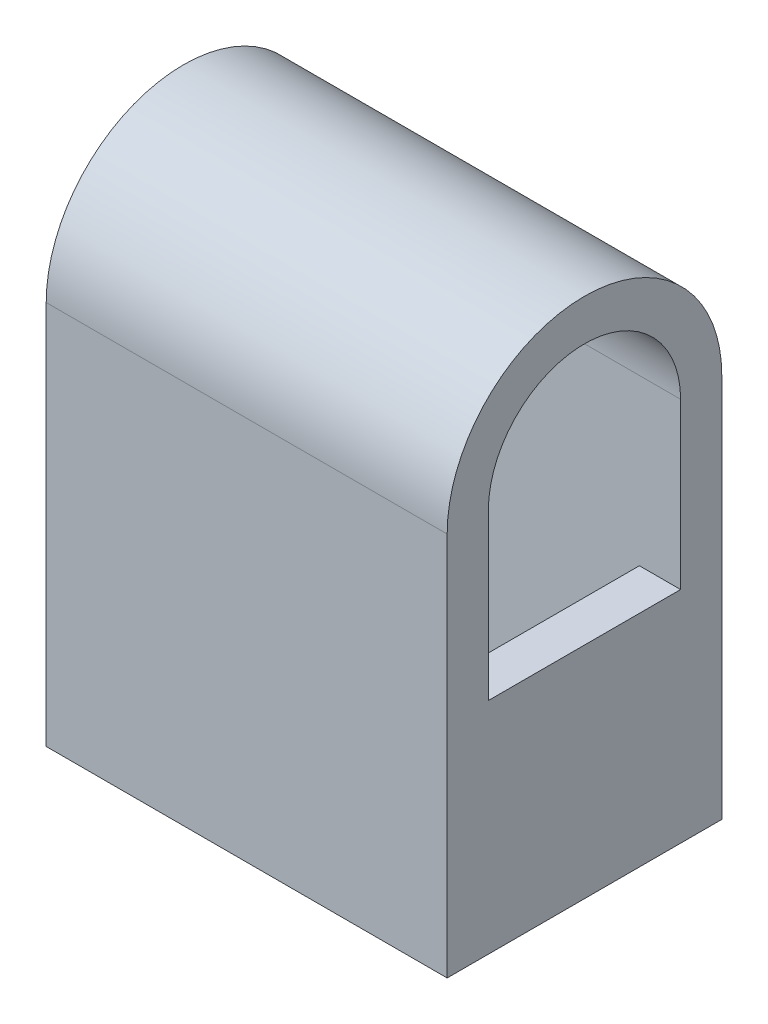
ISO-10303-21;
HEADER;
FILE_DESCRIPTION(('STEP AP214'),'2;1');
FILE_NAME('part.step','',(''),(''),'','','');
FILE_SCHEMA(('AUTOMOTIVE_DESIGN { 1 0 10303 214 1 1 1 1 }'));
ENDSEC;
DATA;
#1=APPLICATION_CONTEXT('core data for automotive mechanical design processes');
#2=APPLICATION_PROTOCOL_DEFINITION('international standard','automotive_design',2000,#1);
#3=PRODUCT_CONTEXT('',#1,'mechanical');
#4=PRODUCT('Part','Part','',(#3));
#5=PRODUCT_RELATED_PRODUCT_CATEGORY('part','',(#4));
#6=PRODUCT_DEFINITION_FORMATION('','',#4);
#7=PRODUCT_DEFINITION_CONTEXT('part definition',#1,'design');
#8=PRODUCT_DEFINITION('design','',#6,#7);
#9=PRODUCT_DEFINITION_SHAPE('','',#8);
#10=(LENGTH_UNIT() NAMED_UNIT(*) SI_UNIT(.MILLI.,.METRE.));
#11=(NAMED_UNIT(*) PLANE_ANGLE_UNIT() SI_UNIT($,.RADIAN.));
#12=(NAMED_UNIT(*) SI_UNIT($,.STERADIAN.) SOLID_ANGLE_UNIT());
#13=UNCERTAINTY_MEASURE_WITH_UNIT(LENGTH_MEASURE(1.E-05),#10,'distance_accuracy_value','');
#14=(GEOMETRIC_REPRESENTATION_CONTEXT(3) GLOBAL_UNCERTAINTY_ASSIGNED_CONTEXT((#13)) GLOBAL_UNIT_ASSIGNED_CONTEXT((#10,
#11,#12)) REPRESENTATION_CONTEXT('',''));
#15=CARTESIAN_POINT('',(0.,0.,0.));
#16=DIRECTION('',(0.,0.,1.));
#17=DIRECTION('',(1.,0.,0.));
#18=AXIS2_PLACEMENT_3D('',#15,#16,#17);
#19=CARTESIAN_POINT('',(0.,0.,-12.7));
#20=DIRECTION('',(0.,0.,1.));
#21=DIRECTION('',(1.,0.,0.));
#22=AXIS2_PLACEMENT_3D('',#19,#20,#21);
#23=PLANE('',#22);
#24=DIRECTION('',(0.,-1.,0.));
#25=VECTOR('',#24,1.);
#26=CARTESIAN_POINT('',(6.35,-8.89,-12.7));
#27=LINE('',#26,#25);
#28=CARTESIAN_POINT('',(6.35,3.81,-12.7));
#29=VERTEX_POINT('',#28);
#30=CARTESIAN_POINT('',(6.35,-8.89,-12.7));
#31=VERTEX_POINT('',#30);
#32=EDGE_CURVE('E199',#29,#31,#27,.T.);
#33=ORIENTED_EDGE('',*,*,#32,.F.);
#34=DIRECTION('',(1.,0.,0.));
#35=VECTOR('',#34,1.);
#36=CARTESIAN_POINT('',(6.35,3.81,-12.7));
#37=LINE('',#36,#35);
#38=CARTESIAN_POINT('',(5.08,3.81,-12.7));
#39=VERTEX_POINT('',#38);
#40=EDGE_CURVE('E219',#39,#29,#37,.T.);
#41=ORIENTED_EDGE('',*,*,#40,.F.);
#42=DIRECTION('',(0.,1.,0.));
#43=VECTOR('',#42,1.);
#44=CARTESIAN_POINT('',(5.08,-8.89,-12.7));
#45=LINE('',#44,#43);
#46=CARTESIAN_POINT('',(5.08,-8.89,-12.7));
#47=VERTEX_POINT('',#46);
#48=EDGE_CURVE('E197',#47,#39,#45,.T.);
#49=ORIENTED_EDGE('',*,*,#48,.F.);
#50=DIRECTION('',(1.,0.,0.));
#51=VECTOR('',#50,1.);
#52=CARTESIAN_POINT('',(-5.08,-8.89,-12.7));
#53=LINE('',#52,#51);
#54=CARTESIAN_POINT('',(-5.08,-8.89,-12.7));
#55=VERTEX_POINT('',#54);
#56=EDGE_CURVE('E177',#55,#47,#53,.T.);
#57=ORIENTED_EDGE('',*,*,#56,.F.);
#58=DIRECTION('',(0.,1.,0.));
#59=VECTOR('',#58,1.);
#60=CARTESIAN_POINT('',(-5.08,-8.89,-12.7));
#61=LINE('',#60,#59);
#62=CARTESIAN_POINT('',(-5.08,3.81,-12.7));
#63=VERTEX_POINT('',#62);
#64=EDGE_CURVE('E200',#55,#63,#61,.T.);
#65=ORIENTED_EDGE('',*,*,#64,.T.);
#66=CARTESIAN_POINT('',(-6.35,3.81,-12.7));
#67=VERTEX_POINT('',#66);
#68=EDGE_CURVE('E207',#67,#63,#37,.T.);
#69=ORIENTED_EDGE('',*,*,#68,.F.);
#70=DIRECTION('',(0.,1.,0.));
#71=VECTOR('',#70,1.);
#72=CARTESIAN_POINT('',(-6.35,3.81,-12.7));
#73=LINE('',#72,#71);
#74=CARTESIAN_POINT('',(-6.35,-8.89,-12.7));
#75=VERTEX_POINT('',#74);
#76=EDGE_CURVE('E216',#75,#67,#73,.T.);
#77=ORIENTED_EDGE('',*,*,#76,.F.);
#78=DIRECTION('',(1.,0.,0.));
#79=VECTOR('',#78,1.);
#80=CARTESIAN_POINT('',(9.271,-8.89,-12.7));
#81=LINE('',#80,#79);
#82=CARTESIAN_POINT('',(-9.271,-8.89,-12.7));
#83=VERTEX_POINT('',#82);
#84=EDGE_CURVE('E284',#83,#75,#81,.T.);
#85=ORIENTED_EDGE('',*,*,#84,.F.);
#86=DIRECTION('',(0.,-1.,0.));
#87=VECTOR('',#86,1.);
#88=CARTESIAN_POINT('',(-9.271,-8.89,-12.7));
#89=LINE('',#88,#87);
#90=CARTESIAN_POINT('',(-9.271,8.89,-12.7));
#91=VERTEX_POINT('',#90);
#92=EDGE_CURVE('E270',#91,#83,#89,.T.);
#93=ORIENTED_EDGE('',*,*,#92,.F.);
#94=DIRECTION('',(-1.,0.,0.));
#95=VECTOR('',#94,1.);
#96=CARTESIAN_POINT('',(23.4700316571237,8.89,-12.7));
#97=LINE('',#96,#95);
#98=CARTESIAN_POINT('',(9.271,8.89,-12.7));
#99=VERTEX_POINT('',#98);
#100=EDGE_CURVE('E301',#99,#91,#97,.T.);
#101=ORIENTED_EDGE('',*,*,#100,.F.);
#102=DIRECTION('',(0.,1.,0.));
#103=VECTOR('',#102,1.);
#104=CARTESIAN_POINT('',(9.271,-8.89,-12.7));
#105=LINE('',#104,#103);
#106=CARTESIAN_POINT('',(9.271,-8.89,-12.7));
#107=VERTEX_POINT('',#106);
#108=EDGE_CURVE('E276',#107,#99,#105,.T.);
#109=ORIENTED_EDGE('',*,*,#108,.F.);
#110=EDGE_CURVE('E283',#31,#107,#81,.T.);
#111=ORIENTED_EDGE('',*,*,#110,.F.);
#112=EDGE_LOOP('',(#33,#41,#49,#57,#65,#69,#77,#85,#93,#101,#109,#111));
#113=FACE_BOUND('',#112,.T.);
#114=ADVANCED_FACE('F33',(#113),#23,.F.);
#115=CARTESIAN_POINT('',(9.271,-8.89,-1.905));
#116=DIRECTION('',(1.,0.,0.));
#117=DIRECTION('',(0.,0.,-1.));
#118=AXIS2_PLACEMENT_3D('',#115,#116,#117);
#119=PLANE('',#118);
#120=DIRECTION('',(0.,0.,1.));
#121=VECTOR('',#120,1.);
#122=CARTESIAN_POINT('',(9.271,1.27,-1.905));
#123=LINE('',#122,#121);
#124=CARTESIAN_POINT('',(9.271,1.27,-10.795));
#125=VERTEX_POINT('',#124);
#126=CARTESIAN_POINT('',(9.271,1.27,-1.905));
#127=VERTEX_POINT('',#126);
#128=EDGE_CURVE('E233',#125,#127,#123,.T.);
#129=ORIENTED_EDGE('',*,*,#128,.T.);
#130=DIRECTION('',(0.,1.,0.));
#131=VECTOR('',#130,1.);
#132=CARTESIAN_POINT('',(9.271,-8.89,-1.905));
#133=LINE('',#132,#131);
#134=CARTESIAN_POINT('',(9.271,8.89,-1.905));
#135=VERTEX_POINT('',#134);
#136=EDGE_CURVE('E305',#127,#135,#133,.T.);
#137=ORIENTED_EDGE('',*,*,#136,.T.);
#138=CARTESIAN_POINT('',(9.271,8.89,-6.35));
#139=DIRECTION('',(1.,0.,0.));
#140=DIRECTION('',(0.,0.,-1.));
#141=AXIS2_PLACEMENT_3D('',#138,#139,#140);
#142=CIRCLE('',#141,4.445);
#143=CARTESIAN_POINT('',(9.271,8.89,-10.795));
#144=VERTEX_POINT('',#143);
#145=EDGE_CURVE('E295',#144,#135,#142,.T.);
#146=ORIENTED_EDGE('',*,*,#145,.F.);
#147=DIRECTION('',(0.,1.,0.));
#148=VECTOR('',#147,1.);
#149=CARTESIAN_POINT('',(9.271,-8.89,-10.795));
#150=LINE('',#149,#148);
#151=EDGE_CURVE('E278',#125,#144,#150,.T.);
#152=ORIENTED_EDGE('',*,*,#151,.F.);
#153=EDGE_LOOP('',(#129,#137,#146,#152));
#154=FACE_BOUND('',#153,.T.);
#155=DIRECTION('',(0.,1.,0.));
#156=VECTOR('',#155,1.);
#157=CARTESIAN_POINT('',(9.271,-8.89,0.));
#158=LINE('',#157,#156);
#159=CARTESIAN_POINT('',(9.271,-8.89,0.));
#160=VERTEX_POINT('',#159);
#161=CARTESIAN_POINT('',(9.271,8.89,0.));
#162=VERTEX_POINT('',#161);
#163=EDGE_CURVE('E298',#160,#162,#158,.T.);
#164=ORIENTED_EDGE('',*,*,#163,.F.);
#165=DIRECTION('',(0.,0.,1.));
#166=VECTOR('',#165,1.);
#167=CARTESIAN_POINT('',(9.271,-8.89,-1.905));
#168=LINE('',#167,#166);
#169=EDGE_CURVE('E11',#107,#160,#168,.T.);
#170=ORIENTED_EDGE('',*,*,#169,.F.);
#171=ORIENTED_EDGE('',*,*,#108,.T.);
#172=CARTESIAN_POINT('',(9.271,8.89,-6.35));
#173=DIRECTION('',(1.,0.,0.));
#174=DIRECTION('',(0.,0.,-1.));
#175=AXIS2_PLACEMENT_3D('',#172,#173,#174);
#176=CIRCLE('',#175,6.35);
#177=EDGE_CURVE('E292',#162,#99,#176,.F.);
#178=ORIENTED_EDGE('',*,*,#177,.F.);
#179=EDGE_LOOP('',(#164,#170,#171,#178));
#180=FACE_BOUND('',#179,.T.);
#181=ADVANCED_FACE('F35',(#154,#180),#119,.T.);
#182=CARTESIAN_POINT('',(-9.271,-8.89,-1.905));
#183=DIRECTION('',(0.,-1.,0.));
#184=DIRECTION('',(0.,0.,-1.));
#185=AXIS2_PLACEMENT_3D('',#182,#183,#184);
#186=PLANE('',#185);
#187=DIRECTION('',(0.,0.,-1.));
#188=VECTOR('',#187,1.);
#189=CARTESIAN_POINT('',(5.08,-8.89,-12.7));
#190=LINE('',#189,#188);
#191=CARTESIAN_POINT('',(5.08,-8.89,-14.478));
#192=VERTEX_POINT('',#191);
#193=EDGE_CURVE('E171',#47,#192,#190,.T.);
#194=ORIENTED_EDGE('',*,*,#193,.T.);
#195=DIRECTION('',(-0.999984123697854,0.,0.00563492255810706));
#196=VECTOR('',#195,1.);
#197=CARTESIAN_POINT('',(5.08,-8.89,-14.478));
#198=LINE('',#197,#196);
#199=CARTESIAN_POINT('',(-5.08,-8.89,-14.420748277864));
#200=VERTEX_POINT('',#199);
#201=EDGE_CURVE('E180',#192,#200,#198,.T.);
#202=ORIENTED_EDGE('',*,*,#201,.T.);
#203=DIRECTION('',(0.,0.,1.));
#204=VECTOR('',#203,1.);
#205=CARTESIAN_POINT('',(-5.08,-8.89,-14.420748277864));
#206=LINE('',#205,#204);
#207=EDGE_CURVE('E48',#200,#55,#206,.T.);
#208=ORIENTED_EDGE('',*,*,#207,.T.);
#209=ORIENTED_EDGE('',*,*,#56,.T.);
#210=EDGE_LOOP('',(#194,#202,#208,#209));
#211=FACE_BOUND('',#210,.T.);
#212=ORIENTED_EDGE('',*,*,#84,.T.);
#213=DIRECTION('',(0.,0.,1.));
#214=VECTOR('',#213,1.);
#215=CARTESIAN_POINT('',(-6.35,-8.89,-14.986));
#216=LINE('',#215,#214);
#217=CARTESIAN_POINT('',(-6.35,-8.89,-14.986));
#218=VERTEX_POINT('',#217);
#219=EDGE_CURVE('E227',#218,#75,#216,.T.);
#220=ORIENTED_EDGE('',*,*,#219,.F.);
#221=DIRECTION('',(-1.,0.,0.));
#222=VECTOR('',#221,1.);
#223=CARTESIAN_POINT('',(-6.35,-8.89,-14.986));
#224=LINE('',#223,#222);
#225=CARTESIAN_POINT('',(6.35,-8.89,-14.986));
#226=VERTEX_POINT('',#225);
#227=EDGE_CURVE('E206',#226,#218,#224,.T.);
#228=ORIENTED_EDGE('',*,*,#227,.F.);
#229=DIRECTION('',(0.,0.,1.));
#230=VECTOR('',#229,1.);
#231=CARTESIAN_POINT('',(6.35,-8.89,-14.986));
#232=LINE('',#231,#230);
#233=EDGE_CURVE('E230',#226,#31,#232,.T.);
#234=ORIENTED_EDGE('',*,*,#233,.T.);
#235=ORIENTED_EDGE('',*,*,#110,.T.);
#236=ORIENTED_EDGE('',*,*,#169,.T.);
#237=DIRECTION('',(1.,0.,0.));
#238=VECTOR('',#237,1.);
#239=CARTESIAN_POINT('',(-9.271,-8.89,0.));
#240=LINE('',#239,#238);
#241=CARTESIAN_POINT('',(-9.271,-8.89,0.));
#242=VERTEX_POINT('',#241);
#243=EDGE_CURVE('E308',#242,#160,#240,.T.);
#244=ORIENTED_EDGE('',*,*,#243,.F.);
#245=DIRECTION('',(0.,0.,1.));
#246=VECTOR('',#245,1.);
#247=CARTESIAN_POINT('',(-9.271,-8.89,-1.905));
#248=LINE('',#247,#246);
#249=EDGE_CURVE('E37',#83,#242,#248,.T.);
#250=ORIENTED_EDGE('',*,*,#249,.F.);
#251=EDGE_LOOP('',(#212,#220,#228,#234,#235,#236,#244,#250));
#252=FACE_BOUND('',#251,.T.);
#253=DIRECTION('',(1.,0.,0.));
#254=VECTOR('',#253,1.);
#255=CARTESIAN_POINT('',(-9.271,-8.89,-1.905));
#256=LINE('',#255,#254);
#257=CARTESIAN_POINT('',(-7.366,-8.89,-1.905));
#258=VERTEX_POINT('',#257);
#259=CARTESIAN_POINT('',(7.366,-8.89,-1.905));
#260=VERTEX_POINT('',#259);
#261=EDGE_CURVE('E313',#258,#260,#256,.T.);
#262=ORIENTED_EDGE('',*,*,#261,.T.);
#263=DIRECTION('',(0.,0.,-1.));
#264=VECTOR('',#263,1.);
#265=CARTESIAN_POINT('',(7.366,-8.89,-1.905));
#266=LINE('',#265,#264);
#267=CARTESIAN_POINT('',(7.366,-8.89,-10.795));
#268=VERTEX_POINT('',#267);
#269=EDGE_CURVE('E242',#260,#268,#266,.T.);
#270=ORIENTED_EDGE('',*,*,#269,.T.);
#271=DIRECTION('',(1.,0.,0.));
#272=VECTOR('',#271,1.);
#273=CARTESIAN_POINT('',(9.271,-8.89,-10.795));
#274=LINE('',#273,#272);
#275=CARTESIAN_POINT('',(-7.366,-8.89,-10.795));
#276=VERTEX_POINT('',#275);
#277=EDGE_CURVE('E275',#276,#268,#274,.T.);
#278=ORIENTED_EDGE('',*,*,#277,.F.);
#279=DIRECTION('',(0.,0.,1.));
#280=VECTOR('',#279,1.);
#281=CARTESIAN_POINT('',(-7.366,-8.89,-10.795));
#282=LINE('',#281,#280);
#283=EDGE_CURVE('E255',#276,#258,#282,.T.);
#284=ORIENTED_EDGE('',*,*,#283,.T.);
#285=EDGE_LOOP('',(#262,#270,#278,#284));
#286=FACE_BOUND('',#285,.T.);
#287=ADVANCED_FACE('F184',(#211,#252,#286),#186,.T.);
#288=CARTESIAN_POINT('',(-9.271,-8.89,-1.905));
#289=DIRECTION('',(-1.,0.,0.));
#290=DIRECTION('',(0.,0.,1.));
#291=AXIS2_PLACEMENT_3D('',#288,#289,#290);
#292=PLANE('',#291);
#293=DIRECTION('',(0.,-1.,0.));
#294=VECTOR('',#293,1.);
#295=CARTESIAN_POINT('',(-9.271,-8.89,-1.905));
#296=LINE('',#295,#294);
#297=CARTESIAN_POINT('',(-9.271,8.89,-1.905));
#298=VERTEX_POINT('',#297);
#299=CARTESIAN_POINT('',(-9.271,1.27,-1.905));
#300=VERTEX_POINT('',#299);
#301=EDGE_CURVE('E310',#298,#300,#296,.T.);
#302=ORIENTED_EDGE('',*,*,#301,.T.);
#303=DIRECTION('',(0.,0.,-1.));
#304=VECTOR('',#303,1.);
#305=CARTESIAN_POINT('',(-9.271,1.27,-10.795));
#306=LINE('',#305,#304);
#307=CARTESIAN_POINT('',(-9.271,1.27,-10.795));
#308=VERTEX_POINT('',#307);
#309=EDGE_CURVE('E250',#300,#308,#306,.T.);
#310=ORIENTED_EDGE('',*,*,#309,.T.);
#311=DIRECTION('',(0.,-1.,0.));
#312=VECTOR('',#311,1.);
#313=CARTESIAN_POINT('',(-9.271,-8.89,-10.795));
#314=LINE('',#313,#312);
#315=CARTESIAN_POINT('',(-9.271,8.89,-10.795));
#316=VERTEX_POINT('',#315);
#317=EDGE_CURVE('E273',#316,#308,#314,.T.);
#318=ORIENTED_EDGE('',*,*,#317,.F.);
#319=CARTESIAN_POINT('',(-9.271,8.89,-6.35));
#320=DIRECTION('',(1.,0.,0.));
#321=DIRECTION('',(0.,0.,-1.));
#322=AXIS2_PLACEMENT_3D('',#319,#320,#321);
#323=CIRCLE('',#322,4.445);
#324=EDGE_CURVE('E280',#316,#298,#323,.T.);
#325=ORIENTED_EDGE('',*,*,#324,.T.);
#326=EDGE_LOOP('',(#302,#310,#318,#325));
#327=FACE_BOUND('',#326,.T.);
#328=DIRECTION('',(0.,-1.,0.));
#329=VECTOR('',#328,1.);
#330=CARTESIAN_POINT('',(-9.271,-8.89,0.));
#331=LINE('',#330,#329);
#332=CARTESIAN_POINT('',(-9.271,8.89,0.));
#333=VERTEX_POINT('',#332);
#334=EDGE_CURVE('E321',#333,#242,#331,.T.);
#335=ORIENTED_EDGE('',*,*,#334,.F.);
#336=CARTESIAN_POINT('',(-9.271,8.89,-6.35));
#337=DIRECTION('',(-1.,0.,0.));
#338=DIRECTION('',(0.,0.,1.));
#339=AXIS2_PLACEMENT_3D('',#336,#337,#338);
#340=CIRCLE('',#339,6.35);
#341=EDGE_CURVE('E289',#333,#91,#340,.T.);
#342=ORIENTED_EDGE('',*,*,#341,.T.);
#343=ORIENTED_EDGE('',*,*,#92,.T.);
#344=ORIENTED_EDGE('',*,*,#249,.T.);
#345=EDGE_LOOP('',(#335,#342,#343,#344));
#346=FACE_BOUND('',#345,.T.);
#347=ADVANCED_FACE('F341',(#327,#346),#292,.T.);
#348=CARTESIAN_POINT('',(0.,0.,-1.905));
#349=DIRECTION('',(0.,0.,-1.));
#350=DIRECTION('',(-1.,0.,0.));
#351=AXIS2_PLACEMENT_3D('',#348,#349,#350);
#352=PLANE('',#351);
#353=DIRECTION('',(1.,0.,0.));
#354=VECTOR('',#353,1.);
#355=CARTESIAN_POINT('',(7.366,1.27,-1.905));
#356=LINE('',#355,#354);
#357=CARTESIAN_POINT('',(7.366,1.27,-1.905));
#358=VERTEX_POINT('',#357);
#359=EDGE_CURVE('E247',#358,#127,#356,.T.);
#360=ORIENTED_EDGE('',*,*,#359,.F.);
#361=DIRECTION('',(0.,-1.,0.));
#362=VECTOR('',#361,1.);
#363=CARTESIAN_POINT('',(7.366,-8.89,-1.905));
#364=LINE('',#363,#362);
#365=EDGE_CURVE('E239',#358,#260,#364,.T.);
#366=ORIENTED_EDGE('',*,*,#365,.T.);
#367=ORIENTED_EDGE('',*,*,#261,.F.);
#368=DIRECTION('',(0.,1.,0.));
#369=VECTOR('',#368,1.);
#370=CARTESIAN_POINT('',(-7.366,-8.89,-1.905));
#371=LINE('',#370,#369);
#372=CARTESIAN_POINT('',(-7.366,1.27,-1.905));
#373=VERTEX_POINT('',#372);
#374=EDGE_CURVE('E258',#258,#373,#371,.T.);
#375=ORIENTED_EDGE('',*,*,#374,.T.);
#376=DIRECTION('',(-1.,0.,0.));
#377=VECTOR('',#376,1.);
#378=CARTESIAN_POINT('',(-7.366,1.27,-1.905));
#379=LINE('',#378,#377);
#380=EDGE_CURVE('E264',#373,#300,#379,.T.);
#381=ORIENTED_EDGE('',*,*,#380,.T.);
#382=ORIENTED_EDGE('',*,*,#301,.F.);
#383=DIRECTION('',(-1.,0.,0.));
#384=VECTOR('',#383,1.);
#385=CARTESIAN_POINT('',(-9.271,8.89,-1.905));
#386=LINE('',#385,#384);
#387=EDGE_CURVE('E307',#135,#298,#386,.T.);
#388=ORIENTED_EDGE('',*,*,#387,.F.);
#389=ORIENTED_EDGE('',*,*,#136,.F.);
#390=EDGE_LOOP('',(#360,#366,#367,#375,#381,#382,#388,#389));
#391=FACE_BOUND('',#390,.T.);
#392=ADVANCED_FACE('F387',(#391),#352,.T.);
#393=CARTESIAN_POINT('',(0.,0.,0.));
#394=DIRECTION('',(0.,0.,-1.));
#395=DIRECTION('',(-1.,0.,0.));
#396=AXIS2_PLACEMENT_3D('',#393,#394,#395);
#397=PLANE('',#396);
#398=ORIENTED_EDGE('',*,*,#163,.T.);
#399=DIRECTION('',(-1.,0.,0.));
#400=VECTOR('',#399,1.);
#401=CARTESIAN_POINT('',(-9.271,8.89,0.));
#402=LINE('',#401,#400);
#403=EDGE_CURVE('E318',#162,#333,#402,.T.);
#404=ORIENTED_EDGE('',*,*,#403,.T.);
#405=ORIENTED_EDGE('',*,*,#334,.T.);
#406=ORIENTED_EDGE('',*,*,#243,.T.);
#407=EDGE_LOOP('',(#398,#404,#405,#406));
#408=FACE_BOUND('',#407,.T.);
#409=ADVANCED_FACE('F327',(#408),#397,.F.);
#410=CARTESIAN_POINT('',(23.4700316571237,8.89,-6.35));
#411=DIRECTION('',(-1.,0.,0.));
#412=DIRECTION('',(0.,0.,1.));
#413=AXIS2_PLACEMENT_3D('',#410,#411,#412);
#414=CYLINDRICAL_SURFACE('',#413,6.35);
#415=ORIENTED_EDGE('',*,*,#403,.F.);
#416=ORIENTED_EDGE('',*,*,#177,.T.);
#417=ORIENTED_EDGE('',*,*,#100,.T.);
#418=ORIENTED_EDGE('',*,*,#341,.F.);
#419=EDGE_LOOP('',(#415,#416,#417,#418));
#420=FACE_BOUND('',#419,.T.);
#421=ADVANCED_FACE('F338',(#420),#414,.T.);
#422=CARTESIAN_POINT('',(23.4700316571237,8.89,-6.35));
#423=DIRECTION('',(-1.,0.,0.));
#424=DIRECTION('',(0.,0.,1.));
#425=AXIS2_PLACEMENT_3D('',#422,#423,#424);
#426=CYLINDRICAL_SURFACE('',#425,4.445);
#427=DIRECTION('',(-1.,0.,0.));
#428=VECTOR('',#427,1.);
#429=CARTESIAN_POINT('',(23.4700316571237,8.89,-10.795));
#430=LINE('',#429,#428);
#431=EDGE_CURVE('E299',#144,#316,#430,.T.);
#432=ORIENTED_EDGE('',*,*,#431,.F.);
#433=ORIENTED_EDGE('',*,*,#145,.T.);
#434=ORIENTED_EDGE('',*,*,#387,.T.);
#435=ORIENTED_EDGE('',*,*,#324,.F.);
#436=EDGE_LOOP('',(#432,#433,#434,#435));
#437=FACE_BOUND('',#436,.T.);
#438=ADVANCED_FACE('F381',(#437),#426,.F.);
#439=CARTESIAN_POINT('',(0.,0.,-10.795));
#440=DIRECTION('',(0.,0.,1.));
#441=DIRECTION('',(1.,0.,0.));
#442=AXIS2_PLACEMENT_3D('',#439,#440,#441);
#443=PLANE('',#442);
#444=DIRECTION('',(1.,0.,0.));
#445=VECTOR('',#444,1.);
#446=CARTESIAN_POINT('',(7.366,1.27,-10.795));
#447=LINE('',#446,#445);
#448=CARTESIAN_POINT('',(7.366,1.27,-10.795));
#449=VERTEX_POINT('',#448);
#450=EDGE_CURVE('E245',#449,#125,#447,.T.);
#451=ORIENTED_EDGE('',*,*,#450,.T.);
#452=ORIENTED_EDGE('',*,*,#151,.T.);
#453=ORIENTED_EDGE('',*,*,#431,.T.);
#454=ORIENTED_EDGE('',*,*,#317,.T.);
#455=DIRECTION('',(-1.,0.,0.));
#456=VECTOR('',#455,1.);
#457=CARTESIAN_POINT('',(-7.366,1.27,-10.795));
#458=LINE('',#457,#456);
#459=CARTESIAN_POINT('',(-7.366,1.27,-10.795));
#460=VERTEX_POINT('',#459);
#461=EDGE_CURVE('E267',#460,#308,#458,.T.);
#462=ORIENTED_EDGE('',*,*,#461,.F.);
#463=DIRECTION('',(0.,-1.,0.));
#464=VECTOR('',#463,1.);
#465=CARTESIAN_POINT('',(-7.366,-8.89,-10.795));
#466=LINE('',#465,#464);
#467=EDGE_CURVE('E253',#460,#276,#466,.T.);
#468=ORIENTED_EDGE('',*,*,#467,.T.);
#469=ORIENTED_EDGE('',*,*,#277,.T.);
#470=DIRECTION('',(0.,1.,0.));
#471=VECTOR('',#470,1.);
#472=CARTESIAN_POINT('',(7.366,-8.89,-10.795));
#473=LINE('',#472,#471);
#474=EDGE_CURVE('E234',#268,#449,#473,.T.);
#475=ORIENTED_EDGE('',*,*,#474,.T.);
#476=EDGE_LOOP('',(#451,#452,#453,#454,#462,#468,#469,#475));
#477=FACE_BOUND('',#476,.T.);
#478=ADVANCED_FACE('F379',(#477),#443,.T.);
#479=CARTESIAN_POINT('',(-7.366,1.27,-10.795));
#480=DIRECTION('',(0.,1.,0.));
#481=DIRECTION('',(0.,0.,1.));
#482=AXIS2_PLACEMENT_3D('',#479,#480,#481);
#483=PLANE('',#482);
#484=ORIENTED_EDGE('',*,*,#309,.F.);
#485=ORIENTED_EDGE('',*,*,#380,.F.);
#486=DIRECTION('',(0.,0.,-1.));
#487=VECTOR('',#486,1.);
#488=CARTESIAN_POINT('',(-7.366,1.27,-10.795));
#489=LINE('',#488,#487);
#490=EDGE_CURVE('E261',#373,#460,#489,.T.);
#491=ORIENTED_EDGE('',*,*,#490,.T.);
#492=ORIENTED_EDGE('',*,*,#461,.T.);
#493=EDGE_LOOP('',(#484,#485,#491,#492));
#494=FACE_BOUND('',#493,.T.);
#495=ADVANCED_FACE('F408',(#494),#483,.T.);
#496=CARTESIAN_POINT('',(-7.366,0.,0.));
#497=DIRECTION('',(1.,0.,0.));
#498=DIRECTION('',(0.,0.,-1.));
#499=AXIS2_PLACEMENT_3D('',#496,#497,#498);
#500=PLANE('',#499);
#501=ORIENTED_EDGE('',*,*,#467,.F.);
#502=ORIENTED_EDGE('',*,*,#490,.F.);
#503=ORIENTED_EDGE('',*,*,#374,.F.);
#504=ORIENTED_EDGE('',*,*,#283,.F.);
#505=EDGE_LOOP('',(#501,#502,#503,#504));
#506=FACE_BOUND('',#505,.T.);
#507=ADVANCED_FACE('F411',(#506),#500,.T.);
#508=CARTESIAN_POINT('',(7.366,1.27,-1.905));
#509=DIRECTION('',(0.,1.,0.));
#510=DIRECTION('',(0.,0.,1.));
#511=AXIS2_PLACEMENT_3D('',#508,#509,#510);
#512=PLANE('',#511);
#513=ORIENTED_EDGE('',*,*,#128,.F.);
#514=ORIENTED_EDGE('',*,*,#450,.F.);
#515=DIRECTION('',(0.,0.,1.));
#516=VECTOR('',#515,1.);
#517=CARTESIAN_POINT('',(7.366,1.27,-1.905));
#518=LINE('',#517,#516);
#519=EDGE_CURVE('E236',#449,#358,#518,.T.);
#520=ORIENTED_EDGE('',*,*,#519,.T.);
#521=ORIENTED_EDGE('',*,*,#359,.T.);
#522=EDGE_LOOP('',(#513,#514,#520,#521));
#523=FACE_BOUND('',#522,.T.);
#524=ADVANCED_FACE('F421',(#523),#512,.T.);
#525=CARTESIAN_POINT('',(7.366,0.,0.));
#526=DIRECTION('',(-1.,0.,0.));
#527=DIRECTION('',(0.,0.,1.));
#528=AXIS2_PLACEMENT_3D('',#525,#526,#527);
#529=PLANE('',#528);
#530=ORIENTED_EDGE('',*,*,#474,.F.);
#531=ORIENTED_EDGE('',*,*,#269,.F.);
#532=ORIENTED_EDGE('',*,*,#365,.F.);
#533=ORIENTED_EDGE('',*,*,#519,.F.);
#534=EDGE_LOOP('',(#530,#531,#532,#533));
#535=FACE_BOUND('',#534,.T.);
#536=ADVANCED_FACE('F417',(#535),#529,.T.);
#537=CARTESIAN_POINT('',(6.35,-8.89,-14.986));
#538=DIRECTION('',(-1.,0.,0.));
#539=DIRECTION('',(0.,0.,1.));
#540=AXIS2_PLACEMENT_3D('',#537,#538,#539);
#541=PLANE('',#540);
#542=ORIENTED_EDGE('',*,*,#32,.T.);
#543=ORIENTED_EDGE('',*,*,#233,.F.);
#544=DIRECTION('',(0.,-1.,0.));
#545=VECTOR('',#544,1.);
#546=CARTESIAN_POINT('',(6.35,-8.89,-14.986));
#547=LINE('',#546,#545);
#548=CARTESIAN_POINT('',(6.35,3.81,-14.986));
#549=VERTEX_POINT('',#548);
#550=EDGE_CURVE('E203',#549,#226,#547,.T.);
#551=ORIENTED_EDGE('',*,*,#550,.F.);
#552=DIRECTION('',(0.,0.,1.));
#553=VECTOR('',#552,1.);
#554=CARTESIAN_POINT('',(6.35,3.81,-14.986));
#555=LINE('',#554,#553);
#556=EDGE_CURVE('E213',#549,#29,#555,.T.);
#557=ORIENTED_EDGE('',*,*,#556,.T.);
#558=EDGE_LOOP('',(#542,#543,#551,#557));
#559=FACE_BOUND('',#558,.T.);
#560=ADVANCED_FACE('F356',(#559),#541,.F.);
#561=CARTESIAN_POINT('',(-6.35,3.81,-14.986));
#562=DIRECTION('',(1.,0.,0.));
#563=DIRECTION('',(0.,0.,-1.));
#564=AXIS2_PLACEMENT_3D('',#561,#562,#563);
#565=PLANE('',#564);
#566=ORIENTED_EDGE('',*,*,#76,.T.);
#567=DIRECTION('',(0.,0.,1.));
#568=VECTOR('',#567,1.);
#569=CARTESIAN_POINT('',(-6.35,3.81,-14.986));
#570=LINE('',#569,#568);
#571=CARTESIAN_POINT('',(-6.35,3.81,-14.986));
#572=VERTEX_POINT('',#571);
#573=EDGE_CURVE('E224',#572,#67,#570,.T.);
#574=ORIENTED_EDGE('',*,*,#573,.F.);
#575=DIRECTION('',(0.,1.,0.));
#576=VECTOR('',#575,1.);
#577=CARTESIAN_POINT('',(-6.35,3.81,-14.986));
#578=LINE('',#577,#576);
#579=EDGE_CURVE('E209',#218,#572,#578,.T.);
#580=ORIENTED_EDGE('',*,*,#579,.F.);
#581=ORIENTED_EDGE('',*,*,#219,.T.);
#582=EDGE_LOOP('',(#566,#574,#580,#581));
#583=FACE_BOUND('',#582,.T.);
#584=ADVANCED_FACE('F347',(#583),#565,.F.);
#585=CARTESIAN_POINT('',(6.35,3.81,-14.986));
#586=DIRECTION('',(0.,-1.,0.));
#587=DIRECTION('',(0.,0.,-1.));
#588=AXIS2_PLACEMENT_3D('',#585,#586,#587);
#589=PLANE('',#588);
#590=DIRECTION('',(-0.999984123697854,0.,0.00563492255810706));
#591=VECTOR('',#590,1.);
#592=CARTESIAN_POINT('',(5.08,3.81,-14.478));
#593=LINE('',#592,#591);
#594=CARTESIAN_POINT('',(5.08,3.81,-14.478));
#595=VERTEX_POINT('',#594);
#596=CARTESIAN_POINT('',(-5.08,3.81,-14.420748277864));
#597=VERTEX_POINT('',#596);
#598=EDGE_CURVE('E190',#595,#597,#593,.T.);
#599=ORIENTED_EDGE('',*,*,#598,.F.);
#600=DIRECTION('',(0.,0.,-1.));
#601=VECTOR('',#600,1.);
#602=CARTESIAN_POINT('',(5.08,3.81,-12.7));
#603=LINE('',#602,#601);
#604=EDGE_CURVE('E56',#39,#595,#603,.T.);
#605=ORIENTED_EDGE('',*,*,#604,.F.);
#606=ORIENTED_EDGE('',*,*,#40,.T.);
#607=ORIENTED_EDGE('',*,*,#556,.F.);
#608=DIRECTION('',(1.,0.,0.));
#609=VECTOR('',#608,1.);
#610=CARTESIAN_POINT('',(6.35,3.81,-14.986));
#611=LINE('',#610,#609);
#612=EDGE_CURVE('E211',#572,#549,#611,.T.);
#613=ORIENTED_EDGE('',*,*,#612,.F.);
#614=ORIENTED_EDGE('',*,*,#573,.T.);
#615=ORIENTED_EDGE('',*,*,#68,.T.);
#616=DIRECTION('',(0.,0.,1.));
#617=VECTOR('',#616,1.);
#618=CARTESIAN_POINT('',(-5.08,3.81,-14.420748277864));
#619=LINE('',#618,#617);
#620=EDGE_CURVE('E187',#597,#63,#619,.T.);
#621=ORIENTED_EDGE('',*,*,#620,.F.);
#622=EDGE_LOOP('',(#599,#605,#606,#607,#613,#614,#615,#621));
#623=FACE_BOUND('',#622,.T.);
#624=ADVANCED_FACE('F359',(#623),#589,.F.);
#625=CARTESIAN_POINT('',(0.,0.,-14.986));
#626=DIRECTION('',(0.,0.,1.));
#627=DIRECTION('',(1.,0.,0.));
#628=AXIS2_PLACEMENT_3D('',#625,#626,#627);
#629=PLANE('',#628);
#630=ORIENTED_EDGE('',*,*,#550,.T.);
#631=ORIENTED_EDGE('',*,*,#227,.T.);
#632=ORIENTED_EDGE('',*,*,#579,.T.);
#633=ORIENTED_EDGE('',*,*,#612,.T.);
#634=EDGE_LOOP('',(#630,#631,#632,#633));
#635=FACE_BOUND('',#634,.T.);
#636=ADVANCED_FACE('F351',(#635),#629,.F.);
#637=CARTESIAN_POINT('',(5.08,-8.89,-12.7));
#638=DIRECTION('',(1.,0.,0.));
#639=DIRECTION('',(0.,0.,-1.));
#640=AXIS2_PLACEMENT_3D('',#637,#638,#639);
#641=PLANE('',#640);
#642=ORIENTED_EDGE('',*,*,#604,.T.);
#643=DIRECTION('',(0.,1.,0.));
#644=VECTOR('',#643,1.);
#645=CARTESIAN_POINT('',(5.08,-8.89,-14.478));
#646=LINE('',#645,#644);
#647=EDGE_CURVE('E167',#192,#595,#646,.T.);
#648=ORIENTED_EDGE('',*,*,#647,.F.);
#649=ORIENTED_EDGE('',*,*,#193,.F.);
#650=ORIENTED_EDGE('',*,*,#48,.T.);
#651=EDGE_LOOP('',(#642,#648,#649,#650));
#652=FACE_BOUND('',#651,.T.);
#653=ADVANCED_FACE('F169',(#652),#641,.F.);
#654=CARTESIAN_POINT('',(-5.08,-8.89,-14.420748277864));
#655=DIRECTION('',(-1.,0.,0.));
#656=DIRECTION('',(0.,0.,1.));
#657=AXIS2_PLACEMENT_3D('',#654,#655,#656);
#658=PLANE('',#657);
#659=ORIENTED_EDGE('',*,*,#620,.T.);
#660=ORIENTED_EDGE('',*,*,#64,.F.);
#661=ORIENTED_EDGE('',*,*,#207,.F.);
#662=DIRECTION('',(0.,1.,0.));
#663=VECTOR('',#662,1.);
#664=CARTESIAN_POINT('',(-5.08,-8.89,-14.420748277864));
#665=LINE('',#664,#663);
#666=EDGE_CURVE('E176',#200,#597,#665,.T.);
#667=ORIENTED_EDGE('',*,*,#666,.T.);
#668=EDGE_LOOP('',(#659,#660,#661,#667));
#669=FACE_BOUND('',#668,.T.);
#670=ADVANCED_FACE('F361',(#669),#658,.F.);
#671=CARTESIAN_POINT('',(5.08,-8.89,-14.478));
#672=DIRECTION('',(-0.00563492255810706,0.,-0.999984123697853));
#673=DIRECTION('',(-0.999984123697854,0.,0.00563492255810706));
#674=AXIS2_PLACEMENT_3D('',#671,#672,#673);
#675=PLANE('',#674);
#676=ORIENTED_EDGE('',*,*,#598,.T.);
#677=ORIENTED_EDGE('',*,*,#666,.F.);
#678=ORIENTED_EDGE('',*,*,#201,.F.);
#679=ORIENTED_EDGE('',*,*,#647,.T.);
#680=EDGE_LOOP('',(#676,#677,#678,#679));
#681=FACE_BOUND('',#680,.T.);
#682=ADVANCED_FACE('F181',(#681),#675,.F.);
#683=CLOSED_SHELL('',(#114,#181,#287,#347,#392,#409,#421,#438,#478,#495,#507,#524,#536,#560,
#584,#624,#636,#653,#670,#682));
#684=MANIFOLD_SOLID_BREP('B2',#683);
#685=ADVANCED_BREP_SHAPE_REPRESENTATION('',(#18,#684),#14);
#686=SHAPE_DEFINITION_REPRESENTATION(#9,#685);
ENDSEC;
END-ISO-10303-21;
